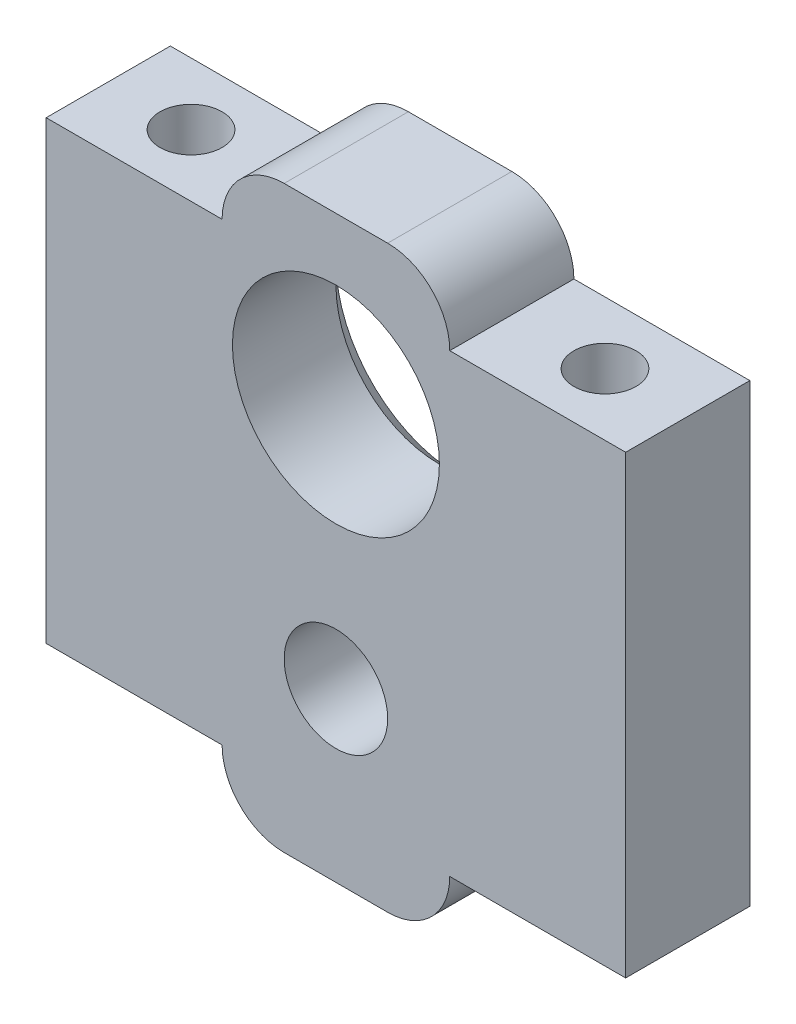
ISO-10303-21;
HEADER;
FILE_DESCRIPTION(('STEP AP214'),'2;1');
FILE_NAME('part.step','',(''),(''),'','','');
FILE_SCHEMA(('AUTOMOTIVE_DESIGN { 1 0 10303 214 1 1 1 1 }'));
ENDSEC;
DATA;
#1=APPLICATION_CONTEXT('core data for automotive mechanical design processes');
#2=APPLICATION_PROTOCOL_DEFINITION('international standard','automotive_design',2000,#1);
#3=PRODUCT_CONTEXT('',#1,'mechanical');
#4=PRODUCT('Part','Part','',(#3));
#5=PRODUCT_RELATED_PRODUCT_CATEGORY('part','',(#4));
#6=PRODUCT_DEFINITION_FORMATION('','',#4);
#7=PRODUCT_DEFINITION_CONTEXT('part definition',#1,'design');
#8=PRODUCT_DEFINITION('design','',#6,#7);
#9=PRODUCT_DEFINITION_SHAPE('','',#8);
#10=(LENGTH_UNIT() NAMED_UNIT(*) SI_UNIT(.MILLI.,.METRE.));
#11=(NAMED_UNIT(*) PLANE_ANGLE_UNIT() SI_UNIT($,.RADIAN.));
#12=(NAMED_UNIT(*) SI_UNIT($,.STERADIAN.) SOLID_ANGLE_UNIT());
#13=UNCERTAINTY_MEASURE_WITH_UNIT(LENGTH_MEASURE(1.E-05),#10,'distance_accuracy_value','');
#14=(GEOMETRIC_REPRESENTATION_CONTEXT(3) GLOBAL_UNCERTAINTY_ASSIGNED_CONTEXT((#13)) GLOBAL_UNIT_ASSIGNED_CONTEXT((#10,
#11,#12)) REPRESENTATION_CONTEXT('',''));
#15=CARTESIAN_POINT('',(0.,0.,0.));
#16=DIRECTION('',(0.,0.,1.));
#17=DIRECTION('',(1.,0.,0.));
#18=AXIS2_PLACEMENT_3D('',#15,#16,#17);
#19=CARTESIAN_POINT('',(14.,14.,6.));
#20=DIRECTION('',(-1.,0.,0.));
#21=DIRECTION('',(0.,-1.,0.));
#22=AXIS2_PLACEMENT_3D('',#19,#20,#21);
#23=PLANE('',#22);
#24=DIRECTION('',(0.,0.,1.));
#25=VECTOR('',#24,1.);
#26=CARTESIAN_POINT('',(14.,-11.1,6.));
#27=LINE('',#26,#25);
#28=CARTESIAN_POINT('',(14.,-11.1,0.));
#29=VERTEX_POINT('',#28);
#30=CARTESIAN_POINT('',(14.,-11.1,6.));
#31=VERTEX_POINT('',#30);
#32=EDGE_CURVE('E143',#29,#31,#27,.T.);
#33=ORIENTED_EDGE('',*,*,#32,.F.);
#34=DIRECTION('',(0.,1.,0.));
#35=VECTOR('',#34,1.);
#36=CARTESIAN_POINT('',(14.,14.,0.));
#37=LINE('',#36,#35);
#38=CARTESIAN_POINT('',(14.,10.9,0.));
#39=VERTEX_POINT('',#38);
#40=EDGE_CURVE('E213',#29,#39,#37,.T.);
#41=ORIENTED_EDGE('',*,*,#40,.T.);
#42=DIRECTION('',(0.,0.,1.));
#43=VECTOR('',#42,1.);
#44=CARTESIAN_POINT('',(14.,10.9,6.));
#45=LINE('',#44,#43);
#46=CARTESIAN_POINT('',(14.,10.9,6.));
#47=VERTEX_POINT('',#46);
#48=EDGE_CURVE('E182',#39,#47,#45,.T.);
#49=ORIENTED_EDGE('',*,*,#48,.T.);
#50=DIRECTION('',(0.,1.,0.));
#51=VECTOR('',#50,1.);
#52=CARTESIAN_POINT('',(14.,14.,6.));
#53=LINE('',#52,#51);
#54=EDGE_CURVE('E212',#31,#47,#53,.T.);
#55=ORIENTED_EDGE('',*,*,#54,.F.);
#56=EDGE_LOOP('',(#33,#41,#49,#55));
#57=FACE_BOUND('',#56,.T.);
#58=ADVANCED_FACE('F36',(#57),#23,.F.);
#59=CARTESIAN_POINT('',(10.,14.,3.));
#60=DIRECTION('',(0.,-1.,0.));
#61=DIRECTION('',(1.,0.,0.));
#62=AXIS2_PLACEMENT_3D('',#59,#60,#61);
#63=CYLINDRICAL_SURFACE('',#62,1.5);
#64=CARTESIAN_POINT('',(10.,10.9,3.));
#65=DIRECTION('',(0.,-1.,0.));
#66=DIRECTION('',(0.,0.,-1.));
#67=AXIS2_PLACEMENT_3D('',#64,#65,#66);
#68=CIRCLE('',#67,1.5);
#69=CARTESIAN_POINT('',(10.,10.9,1.5));
#70=VERTEX_POINT('',#69);
#71=EDGE_CURVE('E181',#70,#70,#68,.F.);
#72=ORIENTED_EDGE('',*,*,#71,.T.);
#73=EDGE_LOOP('',(#72));
#74=FACE_BOUND('',#73,.T.);
#75=CARTESIAN_POINT('',(10.,-11.1,3.));
#76=DIRECTION('',(0.,-1.,0.));
#77=DIRECTION('',(0.,0.,-1.));
#78=AXIS2_PLACEMENT_3D('',#75,#76,#77);
#79=CIRCLE('',#78,1.5);
#80=CARTESIAN_POINT('',(10.,-11.1,1.5));
#81=VERTEX_POINT('',#80);
#82=EDGE_CURVE('E157',#81,#81,#79,.F.);
#83=ORIENTED_EDGE('',*,*,#82,.F.);
#84=EDGE_LOOP('',(#83));
#85=FACE_BOUND('',#84,.T.);
#86=ADVANCED_FACE('F285',(#74,#85),#63,.F.);
#87=CARTESIAN_POINT('',(-14.,14.,6.));
#88=DIRECTION('',(1.,0.,0.));
#89=DIRECTION('',(0.,1.,0.));
#90=AXIS2_PLACEMENT_3D('',#87,#88,#89);
#91=PLANE('',#90);
#92=DIRECTION('',(0.,-1.,0.));
#93=VECTOR('',#92,1.);
#94=CARTESIAN_POINT('',(-14.,14.,0.));
#95=LINE('',#94,#93);
#96=CARTESIAN_POINT('',(-14.,10.9,0.));
#97=VERTEX_POINT('',#96);
#98=CARTESIAN_POINT('',(-14.,-11.1,0.));
#99=VERTEX_POINT('',#98);
#100=EDGE_CURVE('E206',#97,#99,#95,.T.);
#101=ORIENTED_EDGE('',*,*,#100,.T.);
#102=DIRECTION('',(0.,0.,1.));
#103=VECTOR('',#102,1.);
#104=CARTESIAN_POINT('',(-14.,-11.1,6.));
#105=LINE('',#104,#103);
#106=CARTESIAN_POINT('',(-14.,-11.1,6.));
#107=VERTEX_POINT('',#106);
#108=EDGE_CURVE('E144',#99,#107,#105,.T.);
#109=ORIENTED_EDGE('',*,*,#108,.T.);
#110=DIRECTION('',(0.,-1.,0.));
#111=VECTOR('',#110,1.);
#112=CARTESIAN_POINT('',(-14.,14.,6.));
#113=LINE('',#112,#111);
#114=CARTESIAN_POINT('',(-14.,10.9,6.));
#115=VERTEX_POINT('',#114);
#116=EDGE_CURVE('E209',#115,#107,#113,.T.);
#117=ORIENTED_EDGE('',*,*,#116,.F.);
#118=DIRECTION('',(0.,0.,1.));
#119=VECTOR('',#118,1.);
#120=CARTESIAN_POINT('',(-14.,10.9,6.));
#121=LINE('',#120,#119);
#122=EDGE_CURVE('E171',#97,#115,#121,.T.);
#123=ORIENTED_EDGE('',*,*,#122,.F.);
#124=EDGE_LOOP('',(#101,#109,#117,#123));
#125=FACE_BOUND('',#124,.T.);
#126=ADVANCED_FACE('F263',(#125),#91,.F.);
#127=CARTESIAN_POINT('',(-10.,14.,3.));
#128=DIRECTION('',(0.,-1.,0.));
#129=DIRECTION('',(1.,0.,0.));
#130=AXIS2_PLACEMENT_3D('',#127,#128,#129);
#131=CYLINDRICAL_SURFACE('',#130,1.5);
#132=CARTESIAN_POINT('',(-10.,-11.1,3.));
#133=DIRECTION('',(0.,-1.,0.));
#134=DIRECTION('',(0.,0.,-1.));
#135=AXIS2_PLACEMENT_3D('',#132,#133,#134);
#136=CIRCLE('',#135,1.5);
#137=CARTESIAN_POINT('',(-10.,-11.1,1.5));
#138=VERTEX_POINT('',#137);
#139=EDGE_CURVE('E149',#138,#138,#136,.T.);
#140=ORIENTED_EDGE('',*,*,#139,.T.);
#141=EDGE_LOOP('',(#140));
#142=FACE_BOUND('',#141,.T.);
#143=CARTESIAN_POINT('',(-10.,10.9,3.));
#144=DIRECTION('',(0.,1.,0.));
#145=DIRECTION('',(0.,0.,1.));
#146=AXIS2_PLACEMENT_3D('',#143,#144,#145);
#147=CIRCLE('',#146,1.5);
#148=CARTESIAN_POINT('',(-10.,10.9,4.5));
#149=VERTEX_POINT('',#148);
#150=EDGE_CURVE('E165',#149,#149,#147,.T.);
#151=ORIENTED_EDGE('',*,*,#150,.T.);
#152=EDGE_LOOP('',(#151));
#153=FACE_BOUND('',#152,.T.);
#154=ADVANCED_FACE('F297',(#142,#153),#131,.F.);
#155=CARTESIAN_POINT('',(0.,0.,6.));
#156=DIRECTION('',(0.,0.,-1.));
#157=DIRECTION('',(-1.,0.,0.));
#158=AXIS2_PLACEMENT_3D('',#155,#156,#157);
#159=PLANE('',#158);
#160=DIRECTION('',(-1.,0.,0.));
#161=VECTOR('',#160,1.);
#162=CARTESIAN_POINT('',(14.,-14.1,6.));
#163=LINE('',#162,#161);
#164=CARTESIAN_POINT('',(2.5,-14.1,6.));
#165=VERTEX_POINT('',#164);
#166=CARTESIAN_POINT('',(-2.5,-14.1,6.));
#167=VERTEX_POINT('',#166);
#168=EDGE_CURVE('E131',#165,#167,#163,.T.);
#169=ORIENTED_EDGE('',*,*,#168,.F.);
#170=CARTESIAN_POINT('',(2.5,-11.1,6.));
#171=DIRECTION('',(0.,0.,-1.));
#172=DIRECTION('',(-1.,0.,0.));
#173=AXIS2_PLACEMENT_3D('',#170,#171,#172);
#174=CIRCLE('',#173,3.);
#175=CARTESIAN_POINT('',(5.5,-11.1,6.));
#176=VERTEX_POINT('',#175);
#177=EDGE_CURVE('E124',#165,#176,#174,.F.);
#178=ORIENTED_EDGE('',*,*,#177,.T.);
#179=DIRECTION('',(-1.,0.,0.));
#180=VECTOR('',#179,1.);
#181=CARTESIAN_POINT('',(0.,-11.1,6.));
#182=LINE('',#181,#180);
#183=EDGE_CURVE('E128',#31,#176,#182,.T.);
#184=ORIENTED_EDGE('',*,*,#183,.F.);
#185=ORIENTED_EDGE('',*,*,#54,.T.);
#186=DIRECTION('',(-1.,0.,0.));
#187=VECTOR('',#186,1.);
#188=CARTESIAN_POINT('',(0.,10.9,6.));
#189=LINE('',#188,#187);
#190=CARTESIAN_POINT('',(5.5,10.9,6.));
#191=VERTEX_POINT('',#190);
#192=EDGE_CURVE('E188',#47,#191,#189,.T.);
#193=ORIENTED_EDGE('',*,*,#192,.T.);
#194=CARTESIAN_POINT('',(2.5,10.9,6.));
#195=DIRECTION('',(0.,0.,-1.));
#196=DIRECTION('',(-1.,0.,0.));
#197=AXIS2_PLACEMENT_3D('',#194,#195,#196);
#198=CIRCLE('',#197,3.);
#199=CARTESIAN_POINT('',(2.5,13.9,6.));
#200=VERTEX_POINT('',#199);
#201=EDGE_CURVE('E51',#191,#200,#198,.F.);
#202=ORIENTED_EDGE('',*,*,#201,.T.);
#203=DIRECTION('',(1.,0.,0.));
#204=VECTOR('',#203,1.);
#205=CARTESIAN_POINT('',(-14.,13.9,6.));
#206=LINE('',#205,#204);
#207=CARTESIAN_POINT('',(-2.5,13.9,6.));
#208=VERTEX_POINT('',#207);
#209=EDGE_CURVE('E190',#208,#200,#206,.T.);
#210=ORIENTED_EDGE('',*,*,#209,.F.);
#211=CARTESIAN_POINT('',(-2.5,10.9,6.));
#212=DIRECTION('',(0.,0.,-1.));
#213=DIRECTION('',(-1.,0.,0.));
#214=AXIS2_PLACEMENT_3D('',#211,#212,#213);
#215=CIRCLE('',#214,3.);
#216=CARTESIAN_POINT('',(-5.5,10.9,6.));
#217=VERTEX_POINT('',#216);
#218=EDGE_CURVE('E242',#208,#217,#215,.F.);
#219=ORIENTED_EDGE('',*,*,#218,.T.);
#220=DIRECTION('',(1.,0.,0.));
#221=VECTOR('',#220,1.);
#222=CARTESIAN_POINT('',(0.,10.9,6.));
#223=LINE('',#222,#221);
#224=EDGE_CURVE('E178',#115,#217,#223,.T.);
#225=ORIENTED_EDGE('',*,*,#224,.F.);
#226=ORIENTED_EDGE('',*,*,#116,.T.);
#227=DIRECTION('',(1.,0.,0.));
#228=VECTOR('',#227,1.);
#229=CARTESIAN_POINT('',(0.,-11.1,6.));
#230=LINE('',#229,#228);
#231=CARTESIAN_POINT('',(-5.5,-11.1,6.));
#232=VERTEX_POINT('',#231);
#233=EDGE_CURVE('E161',#107,#232,#230,.T.);
#234=ORIENTED_EDGE('',*,*,#233,.T.);
#235=CARTESIAN_POINT('',(-2.5,-11.1,6.));
#236=DIRECTION('',(0.,0.,-1.));
#237=DIRECTION('',(-1.,0.,0.));
#238=AXIS2_PLACEMENT_3D('',#235,#236,#237);
#239=CIRCLE('',#238,3.);
#240=EDGE_CURVE('E135',#232,#167,#239,.F.);
#241=ORIENTED_EDGE('',*,*,#240,.T.);
#242=EDGE_LOOP('',(#169,#178,#184,#185,#193,#202,#210,#219,#225,#226,#234,#241));
#243=FACE_BOUND('',#242,.T.);
#244=CARTESIAN_POINT('',(0.,-6.,6.));
#245=DIRECTION('',(0.,0.,1.));
#246=DIRECTION('',(1.,0.,0.));
#247=AXIS2_PLACEMENT_3D('',#244,#245,#246);
#248=CIRCLE('',#247,2.5);
#249=CARTESIAN_POINT('',(2.5,-6.,6.));
#250=VERTEX_POINT('',#249);
#251=EDGE_CURVE('E203',#250,#250,#248,.T.);
#252=ORIENTED_EDGE('',*,*,#251,.F.);
#253=EDGE_LOOP('',(#252));
#254=FACE_BOUND('',#253,.T.);
#255=CARTESIAN_POINT('',(0.,5.9,6.));
#256=DIRECTION('',(0.,0.,1.));
#257=DIRECTION('',(1.,0.,0.));
#258=AXIS2_PLACEMENT_3D('',#255,#256,#257);
#259=CIRCLE('',#258,5.);
#260=CARTESIAN_POINT('',(5.,5.9,6.));
#261=VERTEX_POINT('',#260);
#262=EDGE_CURVE('E197',#261,#261,#259,.T.);
#263=ORIENTED_EDGE('',*,*,#262,.F.);
#264=EDGE_LOOP('',(#263));
#265=FACE_BOUND('',#264,.T.);
#266=ADVANCED_FACE('F126',(#243,#254,#265),#159,.F.);
#267=CARTESIAN_POINT('',(0.,0.,0.));
#268=DIRECTION('',(0.,0.,-1.));
#269=DIRECTION('',(-1.,0.,0.));
#270=AXIS2_PLACEMENT_3D('',#267,#268,#269);
#271=PLANE('',#270);
#272=DIRECTION('',(-1.,0.,0.));
#273=VECTOR('',#272,1.);
#274=CARTESIAN_POINT('',(0.,-11.1,0.));
#275=LINE('',#274,#273);
#276=CARTESIAN_POINT('',(5.5,-11.1,0.));
#277=VERTEX_POINT('',#276);
#278=EDGE_CURVE('E145',#29,#277,#275,.T.);
#279=ORIENTED_EDGE('',*,*,#278,.T.);
#280=CARTESIAN_POINT('',(2.5,-11.1,0.));
#281=DIRECTION('',(0.,0.,-1.));
#282=DIRECTION('',(-1.,0.,0.));
#283=AXIS2_PLACEMENT_3D('',#280,#281,#282);
#284=CIRCLE('',#283,3.);
#285=CARTESIAN_POINT('',(2.5,-14.1,0.));
#286=VERTEX_POINT('',#285);
#287=EDGE_CURVE('E148',#277,#286,#284,.T.);
#288=ORIENTED_EDGE('',*,*,#287,.T.);
#289=DIRECTION('',(-1.,0.,0.));
#290=VECTOR('',#289,1.);
#291=CARTESIAN_POINT('',(14.,-14.1,0.));
#292=LINE('',#291,#290);
#293=CARTESIAN_POINT('',(-2.5,-14.1,0.));
#294=VERTEX_POINT('',#293);
#295=EDGE_CURVE('E194',#286,#294,#292,.T.);
#296=ORIENTED_EDGE('',*,*,#295,.T.);
#297=CARTESIAN_POINT('',(-2.5,-11.1,0.));
#298=DIRECTION('',(0.,0.,-1.));
#299=DIRECTION('',(-1.,0.,0.));
#300=AXIS2_PLACEMENT_3D('',#297,#298,#299);
#301=CIRCLE('',#300,3.);
#302=CARTESIAN_POINT('',(-5.5,-11.1,0.));
#303=VERTEX_POINT('',#302);
#304=EDGE_CURVE('E235',#294,#303,#301,.T.);
#305=ORIENTED_EDGE('',*,*,#304,.T.);
#306=DIRECTION('',(1.,0.,0.));
#307=VECTOR('',#306,1.);
#308=CARTESIAN_POINT('',(0.,-11.1,0.));
#309=LINE('',#308,#307);
#310=EDGE_CURVE('E224',#99,#303,#309,.T.);
#311=ORIENTED_EDGE('',*,*,#310,.F.);
#312=ORIENTED_EDGE('',*,*,#100,.F.);
#313=DIRECTION('',(1.,0.,0.));
#314=VECTOR('',#313,1.);
#315=CARTESIAN_POINT('',(0.,10.9,0.));
#316=LINE('',#315,#314);
#317=CARTESIAN_POINT('',(-5.5,10.9,0.));
#318=VERTEX_POINT('',#317);
#319=EDGE_CURVE('E175',#97,#318,#316,.T.);
#320=ORIENTED_EDGE('',*,*,#319,.T.);
#321=CARTESIAN_POINT('',(-2.5,10.9,0.));
#322=DIRECTION('',(0.,0.,-1.));
#323=DIRECTION('',(-1.,0.,0.));
#324=AXIS2_PLACEMENT_3D('',#321,#322,#323);
#325=CIRCLE('',#324,3.);
#326=CARTESIAN_POINT('',(-2.5,13.9,0.));
#327=VERTEX_POINT('',#326);
#328=EDGE_CURVE('E231',#318,#327,#325,.T.);
#329=ORIENTED_EDGE('',*,*,#328,.T.);
#330=DIRECTION('',(1.,0.,0.));
#331=VECTOR('',#330,1.);
#332=CARTESIAN_POINT('',(-14.,13.9,0.));
#333=LINE('',#332,#331);
#334=CARTESIAN_POINT('',(2.5,13.9,0.));
#335=VERTEX_POINT('',#334);
#336=EDGE_CURVE('E191',#327,#335,#333,.T.);
#337=ORIENTED_EDGE('',*,*,#336,.T.);
#338=CARTESIAN_POINT('',(2.5,10.9,0.));
#339=DIRECTION('',(0.,0.,-1.));
#340=DIRECTION('',(-1.,0.,0.));
#341=AXIS2_PLACEMENT_3D('',#338,#339,#340);
#342=CIRCLE('',#341,3.);
#343=CARTESIAN_POINT('',(5.5,10.9,0.));
#344=VERTEX_POINT('',#343);
#345=EDGE_CURVE('E233',#335,#344,#342,.T.);
#346=ORIENTED_EDGE('',*,*,#345,.T.);
#347=DIRECTION('',(-1.,0.,0.));
#348=VECTOR('',#347,1.);
#349=CARTESIAN_POINT('',(0.,10.9,0.));
#350=LINE('',#349,#348);
#351=EDGE_CURVE('E185',#39,#344,#350,.T.);
#352=ORIENTED_EDGE('',*,*,#351,.F.);
#353=ORIENTED_EDGE('',*,*,#40,.F.);
#354=EDGE_LOOP('',(#279,#288,#296,#305,#311,#312,#320,#329,#337,#346,#352,#353));
#355=FACE_BOUND('',#354,.T.);
#356=CARTESIAN_POINT('',(0.,5.9,0.));
#357=DIRECTION('',(0.,0.,-1.));
#358=DIRECTION('',(-1.,0.,0.));
#359=AXIS2_PLACEMENT_3D('',#356,#357,#358);
#360=CIRCLE('',#359,6.00000000000001);
#361=CARTESIAN_POINT('',(-6.00000000000001,5.9,0.));
#362=VERTEX_POINT('',#361);
#363=EDGE_CURVE('E215',#362,#362,#360,.F.);
#364=ORIENTED_EDGE('',*,*,#363,.T.);
#365=EDGE_LOOP('',(#364));
#366=FACE_BOUND('',#365,.T.);
#367=CARTESIAN_POINT('',(0.,-6.,0.));
#368=DIRECTION('',(0.,0.,1.));
#369=DIRECTION('',(1.,0.,0.));
#370=AXIS2_PLACEMENT_3D('',#367,#368,#369);
#371=CIRCLE('',#370,2.5);
#372=CARTESIAN_POINT('',(2.5,-6.,0.));
#373=VERTEX_POINT('',#372);
#374=EDGE_CURVE('E202',#373,#373,#371,.T.);
#375=ORIENTED_EDGE('',*,*,#374,.T.);
#376=EDGE_LOOP('',(#375));
#377=FACE_BOUND('',#376,.T.);
#378=ADVANCED_FACE('F256',(#355,#366,#377),#271,.T.);
#379=CARTESIAN_POINT('',(0.,-6.,6.));
#380=DIRECTION('',(0.,0.,-1.));
#381=DIRECTION('',(-1.,0.,0.));
#382=AXIS2_PLACEMENT_3D('',#379,#380,#381);
#383=CYLINDRICAL_SURFACE('',#382,2.5);
#384=ORIENTED_EDGE('',*,*,#251,.T.);
#385=EDGE_LOOP('',(#384));
#386=FACE_BOUND('',#385,.T.);
#387=ORIENTED_EDGE('',*,*,#374,.F.);
#388=EDGE_LOOP('',(#387));
#389=FACE_BOUND('',#388,.T.);
#390=ADVANCED_FACE('F393',(#386,#389),#383,.F.);
#391=CARTESIAN_POINT('',(0.,5.9,6.));
#392=DIRECTION('',(0.,0.,-1.));
#393=DIRECTION('',(-1.,0.,0.));
#394=AXIS2_PLACEMENT_3D('',#391,#392,#393);
#395=CYLINDRICAL_SURFACE('',#394,5.);
#396=CARTESIAN_POINT('',(0.,5.9,1.00000000000001));
#397=DIRECTION('',(0.,0.,-1.));
#398=DIRECTION('',(-1.,0.,0.));
#399=AXIS2_PLACEMENT_3D('',#396,#397,#398);
#400=CIRCLE('',#399,5.);
#401=CARTESIAN_POINT('',(-5.,5.9,1.00000000000001));
#402=VERTEX_POINT('',#401);
#403=EDGE_CURVE('E221',#402,#402,#400,.T.);
#404=ORIENTED_EDGE('',*,*,#403,.T.);
#405=EDGE_LOOP('',(#404));
#406=FACE_BOUND('',#405,.T.);
#407=ORIENTED_EDGE('',*,*,#262,.T.);
#408=EDGE_LOOP('',(#407));
#409=FACE_BOUND('',#408,.T.);
#410=ADVANCED_FACE('F301',(#406,#409),#395,.F.);
#411=CARTESIAN_POINT('',(0.,5.9,0.));
#412=DIRECTION('',(0.,0.,-1.));
#413=DIRECTION('',(-1.,0.,0.));
#414=AXIS2_PLACEMENT_3D('',#411,#412,#413);
#415=CONICAL_SURFACE('',#414,6.00000000000001,0.785398163397448);
#416=ORIENTED_EDGE('',*,*,#403,.F.);
#417=EDGE_LOOP('',(#416));
#418=FACE_BOUND('',#417,.T.);
#419=ORIENTED_EDGE('',*,*,#363,.F.);
#420=EDGE_LOOP('',(#419));
#421=FACE_BOUND('',#420,.T.);
#422=ADVANCED_FACE('F298',(#418,#421),#415,.F.);
#423=CARTESIAN_POINT('',(14.,-14.1,6.));
#424=DIRECTION('',(0.,-1.,0.));
#425=DIRECTION('',(0.,0.,-1.));
#426=AXIS2_PLACEMENT_3D('',#423,#424,#425);
#427=PLANE('',#426);
#428=ORIENTED_EDGE('',*,*,#295,.F.);
#429=DIRECTION('',(0.,0.,-1.));
#430=VECTOR('',#429,1.);
#431=CARTESIAN_POINT('',(2.5,-14.1,6.));
#432=LINE('',#431,#430);
#433=EDGE_CURVE('E240',#286,#165,#432,.F.);
#434=ORIENTED_EDGE('',*,*,#433,.T.);
#435=ORIENTED_EDGE('',*,*,#168,.T.);
#436=DIRECTION('',(0.,0.,1.));
#437=VECTOR('',#436,1.);
#438=CARTESIAN_POINT('',(-2.5,-14.1,0.));
#439=LINE('',#438,#437);
#440=EDGE_CURVE('E238',#167,#294,#439,.F.);
#441=ORIENTED_EDGE('',*,*,#440,.T.);
#442=EDGE_LOOP('',(#428,#434,#435,#441));
#443=FACE_BOUND('',#442,.T.);
#444=ADVANCED_FACE('F251',(#443),#427,.T.);
#445=CARTESIAN_POINT('',(-14.,13.9,0.));
#446=DIRECTION('',(0.,-1.,0.));
#447=DIRECTION('',(0.,0.,-1.));
#448=AXIS2_PLACEMENT_3D('',#445,#446,#447);
#449=PLANE('',#448);
#450=ORIENTED_EDGE('',*,*,#209,.T.);
#451=DIRECTION('',(0.,0.,1.));
#452=VECTOR('',#451,1.);
#453=CARTESIAN_POINT('',(2.5,13.9,0.));
#454=LINE('',#453,#452);
#455=EDGE_CURVE('E11',#200,#335,#454,.F.);
#456=ORIENTED_EDGE('',*,*,#455,.T.);
#457=ORIENTED_EDGE('',*,*,#336,.F.);
#458=DIRECTION('',(0.,0.,-1.));
#459=VECTOR('',#458,1.);
#460=CARTESIAN_POINT('',(-2.5,13.9,0.));
#461=LINE('',#460,#459);
#462=EDGE_CURVE('E44',#327,#208,#461,.F.);
#463=ORIENTED_EDGE('',*,*,#462,.T.);
#464=EDGE_LOOP('',(#450,#456,#457,#463));
#465=FACE_BOUND('',#464,.T.);
#466=ADVANCED_FACE('F272',(#465),#449,.F.);
#467=CARTESIAN_POINT('',(0.,10.9,0.));
#468=DIRECTION('',(0.,1.,0.));
#469=DIRECTION('',(0.,0.,1.));
#470=AXIS2_PLACEMENT_3D('',#467,#468,#469);
#471=PLANE('',#470);
#472=ORIENTED_EDGE('',*,*,#150,.F.);
#473=EDGE_LOOP('',(#472));
#474=FACE_BOUND('',#473,.T.);
#475=ORIENTED_EDGE('',*,*,#224,.T.);
#476=DIRECTION('',(0.,0.,-1.));
#477=VECTOR('',#476,1.);
#478=CARTESIAN_POINT('',(-5.5,10.9,8.));
#479=LINE('',#478,#477);
#480=EDGE_CURVE('E168',#217,#318,#479,.T.);
#481=ORIENTED_EDGE('',*,*,#480,.T.);
#482=ORIENTED_EDGE('',*,*,#319,.F.);
#483=ORIENTED_EDGE('',*,*,#122,.T.);
#484=EDGE_LOOP('',(#475,#481,#482,#483));
#485=FACE_BOUND('',#484,.T.);
#486=ADVANCED_FACE('F269',(#474,#485),#471,.T.);
#487=CARTESIAN_POINT('',(0.,10.9,0.));
#488=DIRECTION('',(0.,-1.,0.));
#489=DIRECTION('',(0.,0.,-1.));
#490=AXIS2_PLACEMENT_3D('',#487,#488,#489);
#491=PLANE('',#490);
#492=ORIENTED_EDGE('',*,*,#71,.F.);
#493=EDGE_LOOP('',(#492));
#494=FACE_BOUND('',#493,.T.);
#495=ORIENTED_EDGE('',*,*,#48,.F.);
#496=ORIENTED_EDGE('',*,*,#351,.T.);
#497=DIRECTION('',(0.,0.,1.));
#498=VECTOR('',#497,1.);
#499=CARTESIAN_POINT('',(5.5,10.9,8.));
#500=LINE('',#499,#498);
#501=EDGE_CURVE('E164',#344,#191,#500,.T.);
#502=ORIENTED_EDGE('',*,*,#501,.T.);
#503=ORIENTED_EDGE('',*,*,#192,.F.);
#504=EDGE_LOOP('',(#495,#496,#502,#503));
#505=FACE_BOUND('',#504,.T.);
#506=ADVANCED_FACE('F281',(#494,#505),#491,.F.);
#507=CARTESIAN_POINT('',(0.,-11.1,0.));
#508=DIRECTION('',(0.,-1.,0.));
#509=DIRECTION('',(0.,0.,-1.));
#510=AXIS2_PLACEMENT_3D('',#507,#508,#509);
#511=PLANE('',#510);
#512=ORIENTED_EDGE('',*,*,#82,.T.);
#513=EDGE_LOOP('',(#512));
#514=FACE_BOUND('',#513,.T.);
#515=ORIENTED_EDGE('',*,*,#183,.T.);
#516=DIRECTION('',(0.,0.,-1.));
#517=VECTOR('',#516,1.);
#518=CARTESIAN_POINT('',(5.5,-11.1,-1.5));
#519=LINE('',#518,#517);
#520=EDGE_CURVE('E140',#176,#277,#519,.T.);
#521=ORIENTED_EDGE('',*,*,#520,.T.);
#522=ORIENTED_EDGE('',*,*,#278,.F.);
#523=ORIENTED_EDGE('',*,*,#32,.T.);
#524=EDGE_LOOP('',(#515,#521,#522,#523));
#525=FACE_BOUND('',#524,.T.);
#526=ADVANCED_FACE('F139',(#514,#525),#511,.T.);
#527=CARTESIAN_POINT('',(0.,-11.1,0.));
#528=DIRECTION('',(0.,1.,0.));
#529=DIRECTION('',(0.,0.,1.));
#530=AXIS2_PLACEMENT_3D('',#527,#528,#529);
#531=PLANE('',#530);
#532=ORIENTED_EDGE('',*,*,#139,.F.);
#533=EDGE_LOOP('',(#532));
#534=FACE_BOUND('',#533,.T.);
#535=ORIENTED_EDGE('',*,*,#108,.F.);
#536=ORIENTED_EDGE('',*,*,#310,.T.);
#537=DIRECTION('',(0.,0.,1.));
#538=VECTOR('',#537,1.);
#539=CARTESIAN_POINT('',(-5.5,-11.1,-1.5));
#540=LINE('',#539,#538);
#541=EDGE_CURVE('E152',#303,#232,#540,.T.);
#542=ORIENTED_EDGE('',*,*,#541,.T.);
#543=ORIENTED_EDGE('',*,*,#233,.F.);
#544=EDGE_LOOP('',(#535,#536,#542,#543));
#545=FACE_BOUND('',#544,.T.);
#546=ADVANCED_FACE('F260',(#534,#545),#531,.F.);
#547=CARTESIAN_POINT('',(2.5,-11.1,-1.5));
#548=DIRECTION('',(0.,0.,1.));
#549=DIRECTION('',(1.,0.,0.));
#550=AXIS2_PLACEMENT_3D('',#547,#548,#549);
#551=CYLINDRICAL_SURFACE('',#550,3.);
#552=ORIENTED_EDGE('',*,*,#177,.F.);
#553=ORIENTED_EDGE('',*,*,#433,.F.);
#554=ORIENTED_EDGE('',*,*,#287,.F.);
#555=ORIENTED_EDGE('',*,*,#520,.F.);
#556=EDGE_LOOP('',(#552,#553,#554,#555));
#557=FACE_BOUND('',#556,.T.);
#558=ADVANCED_FACE('F147',(#557),#551,.T.);
#559=CARTESIAN_POINT('',(-2.5,-11.1,-1.5));
#560=DIRECTION('',(0.,0.,-1.));
#561=DIRECTION('',(-1.,0.,0.));
#562=AXIS2_PLACEMENT_3D('',#559,#560,#561);
#563=CYLINDRICAL_SURFACE('',#562,3.);
#564=ORIENTED_EDGE('',*,*,#304,.F.);
#565=ORIENTED_EDGE('',*,*,#440,.F.);
#566=ORIENTED_EDGE('',*,*,#240,.F.);
#567=ORIENTED_EDGE('',*,*,#541,.F.);
#568=EDGE_LOOP('',(#564,#565,#566,#567));
#569=FACE_BOUND('',#568,.T.);
#570=ADVANCED_FACE('F253',(#569),#563,.T.);
#571=CARTESIAN_POINT('',(2.5,10.9,8.));
#572=DIRECTION('',(0.,0.,1.));
#573=DIRECTION('',(1.,0.,0.));
#574=AXIS2_PLACEMENT_3D('',#571,#572,#573);
#575=CYLINDRICAL_SURFACE('',#574,3.);
#576=ORIENTED_EDGE('',*,*,#345,.F.);
#577=ORIENTED_EDGE('',*,*,#455,.F.);
#578=ORIENTED_EDGE('',*,*,#201,.F.);
#579=ORIENTED_EDGE('',*,*,#501,.F.);
#580=EDGE_LOOP('',(#576,#577,#578,#579));
#581=FACE_BOUND('',#580,.T.);
#582=ADVANCED_FACE('F275',(#581),#575,.T.);
#583=CARTESIAN_POINT('',(-2.5,10.9,8.));
#584=DIRECTION('',(0.,0.,-1.));
#585=DIRECTION('',(-1.,0.,0.));
#586=AXIS2_PLACEMENT_3D('',#583,#584,#585);
#587=CYLINDRICAL_SURFACE('',#586,3.);
#588=ORIENTED_EDGE('',*,*,#218,.F.);
#589=ORIENTED_EDGE('',*,*,#462,.F.);
#590=ORIENTED_EDGE('',*,*,#328,.F.);
#591=ORIENTED_EDGE('',*,*,#480,.F.);
#592=EDGE_LOOP('',(#588,#589,#590,#591));
#593=FACE_BOUND('',#592,.T.);
#594=ADVANCED_FACE('F38',(#593),#587,.T.);
#595=CLOSED_SHELL('',(#58,#86,#126,#154,#266,#378,#390,#410,#422,#444,#466,#486,#506,#526,#546,
#558,#570,#582,#594));
#596=MANIFOLD_SOLID_BREP('B2',#595);
#597=ADVANCED_BREP_SHAPE_REPRESENTATION('',(#18,#596),#14);
#598=SHAPE_DEFINITION_REPRESENTATION(#9,#597);
ENDSEC;
END-ISO-10303-21;
